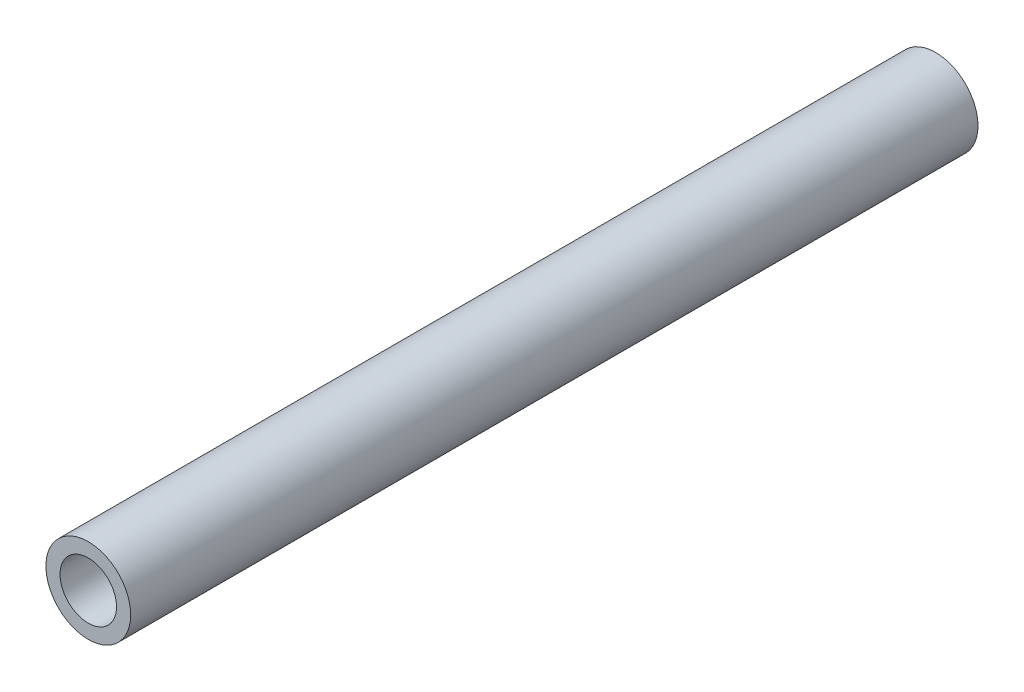
ISO-10303-21;
HEADER;
FILE_DESCRIPTION(('STEP AP214'),'2;1');
FILE_NAME('part.step','',(''),(''),'','','');
FILE_SCHEMA(('AUTOMOTIVE_DESIGN { 1 0 10303 214 1 1 1 1 }'));
ENDSEC;
DATA;
#1=APPLICATION_CONTEXT('core data for automotive mechanical design processes');
#2=APPLICATION_PROTOCOL_DEFINITION('international standard','automotive_design',2000,#1);
#3=PRODUCT_CONTEXT('',#1,'mechanical');
#4=PRODUCT('Part','Part','',(#3));
#5=PRODUCT_RELATED_PRODUCT_CATEGORY('part','',(#4));
#6=PRODUCT_DEFINITION_FORMATION('','',#4);
#7=PRODUCT_DEFINITION_CONTEXT('part definition',#1,'design');
#8=PRODUCT_DEFINITION('design','',#6,#7);
#9=PRODUCT_DEFINITION_SHAPE('','',#8);
#10=(LENGTH_UNIT() NAMED_UNIT(*) SI_UNIT(.MILLI.,.METRE.));
#11=(NAMED_UNIT(*) PLANE_ANGLE_UNIT() SI_UNIT($,.RADIAN.));
#12=(NAMED_UNIT(*) SI_UNIT($,.STERADIAN.) SOLID_ANGLE_UNIT());
#13=UNCERTAINTY_MEASURE_WITH_UNIT(LENGTH_MEASURE(1.E-05),#10,'distance_accuracy_value','');
#14=(GEOMETRIC_REPRESENTATION_CONTEXT(3) GLOBAL_UNCERTAINTY_ASSIGNED_CONTEXT((#13)) GLOBAL_UNIT_ASSIGNED_CONTEXT((#10,
#11,#12)) REPRESENTATION_CONTEXT('',''));
#15=CARTESIAN_POINT('',(0.,0.,0.));
#16=DIRECTION('',(0.,0.,1.));
#17=DIRECTION('',(1.,0.,0.));
#18=AXIS2_PLACEMENT_3D('',#15,#16,#17);
#19=CARTESIAN_POINT('',(-0.992203805522902,0.0115180334406377,30.));
#20=DIRECTION('',(0.,0.,1.));
#21=DIRECTION('',(1.,0.,0.));
#22=AXIS2_PLACEMENT_3D('',#19,#20,#21);
#23=PLANE('',#22);
#24=CARTESIAN_POINT('',(-0.992203805522902,0.0115180334406377,30.));
#25=DIRECTION('',(0.,0.,1.));
#26=DIRECTION('',(1.,0.,0.));
#27=AXIS2_PLACEMENT_3D('',#24,#25,#26);
#28=CIRCLE('',#27,1.5);
#29=CARTESIAN_POINT('',(0.507796194477098,0.0115180334406377,30.));
#30=VERTEX_POINT('',#29);
#31=EDGE_CURVE('E10',#30,#30,#28,.T.);
#32=ORIENTED_EDGE('',*,*,#31,.T.);
#33=EDGE_LOOP('',(#32));
#34=FACE_BOUND('',#33,.T.);
#35=CARTESIAN_POINT('',(-0.992203805522902,0.0115180334406377,30.));
#36=DIRECTION('',(0.,0.,1.));
#37=DIRECTION('',(1.,0.,0.));
#38=AXIS2_PLACEMENT_3D('',#35,#36,#37);
#39=CIRCLE('',#38,1.);
#40=CARTESIAN_POINT('',(0.00779619447709764,0.0115180334406377,30.));
#41=VERTEX_POINT('',#40);
#42=EDGE_CURVE('E43',#41,#41,#39,.T.);
#43=ORIENTED_EDGE('',*,*,#42,.F.);
#44=EDGE_LOOP('',(#43));
#45=FACE_BOUND('',#44,.T.);
#46=ADVANCED_FACE('F32',(#34,#45),#23,.T.);
#47=CARTESIAN_POINT('',(-0.992203805522902,0.0115180334406377,0.));
#48=DIRECTION('',(0.,0.,1.));
#49=DIRECTION('',(1.,0.,0.));
#50=AXIS2_PLACEMENT_3D('',#47,#48,#49);
#51=PLANE('',#50);
#52=CARTESIAN_POINT('',(-0.992203805522902,0.0115180334406377,0.));
#53=DIRECTION('',(0.,0.,1.));
#54=DIRECTION('',(1.,0.,0.));
#55=AXIS2_PLACEMENT_3D('',#52,#53,#54);
#56=CIRCLE('',#55,1.5);
#57=CARTESIAN_POINT('',(0.507796194477098,0.0115180334406377,0.));
#58=VERTEX_POINT('',#57);
#59=EDGE_CURVE('E36',#58,#58,#56,.T.);
#60=ORIENTED_EDGE('',*,*,#59,.F.);
#61=EDGE_LOOP('',(#60));
#62=FACE_BOUND('',#61,.T.);
#63=CARTESIAN_POINT('',(-0.992203805522902,0.0115180334406377,0.));
#64=DIRECTION('',(0.,0.,1.));
#65=DIRECTION('',(1.,0.,0.));
#66=AXIS2_PLACEMENT_3D('',#63,#64,#65);
#67=CIRCLE('',#66,1.);
#68=CARTESIAN_POINT('',(0.00779619447709764,0.0115180334406377,0.));
#69=VERTEX_POINT('',#68);
#70=EDGE_CURVE('E45',#69,#69,#67,.T.);
#71=ORIENTED_EDGE('',*,*,#70,.T.);
#72=EDGE_LOOP('',(#71));
#73=FACE_BOUND('',#72,.T.);
#74=ADVANCED_FACE('F55',(#62,#73),#51,.F.);
#75=CARTESIAN_POINT('',(-0.992203805522902,0.0115180334406377,30.));
#76=DIRECTION('',(0.,0.,-1.));
#77=DIRECTION('',(-1.,0.,0.));
#78=AXIS2_PLACEMENT_3D('',#75,#76,#77);
#79=CYLINDRICAL_SURFACE('',#78,1.5);
#80=ORIENTED_EDGE('',*,*,#31,.F.);
#81=EDGE_LOOP('',(#80));
#82=FACE_BOUND('',#81,.T.);
#83=ORIENTED_EDGE('',*,*,#59,.T.);
#84=EDGE_LOOP('',(#83));
#85=FACE_BOUND('',#84,.T.);
#86=ADVANCED_FACE('F34',(#82,#85),#79,.T.);
#87=CARTESIAN_POINT('',(-0.992203805522902,0.0115180334406377,30.));
#88=DIRECTION('',(0.,0.,-1.));
#89=DIRECTION('',(-1.,0.,0.));
#90=AXIS2_PLACEMENT_3D('',#87,#88,#89);
#91=CYLINDRICAL_SURFACE('',#90,1.);
#92=ORIENTED_EDGE('',*,*,#42,.T.);
#93=EDGE_LOOP('',(#92));
#94=FACE_BOUND('',#93,.T.);
#95=ORIENTED_EDGE('',*,*,#70,.F.);
#96=EDGE_LOOP('',(#95));
#97=FACE_BOUND('',#96,.T.);
#98=ADVANCED_FACE('F51',(#94,#97),#91,.F.);
#99=CLOSED_SHELL('',(#46,#74,#86,#98));
#100=MANIFOLD_SOLID_BREP('B2',#99);
#101=ADVANCED_BREP_SHAPE_REPRESENTATION('',(#18,#100),#14);
#102=SHAPE_DEFINITION_REPRESENTATION(#9,#101);
ENDSEC;
END-ISO-10303-21;
